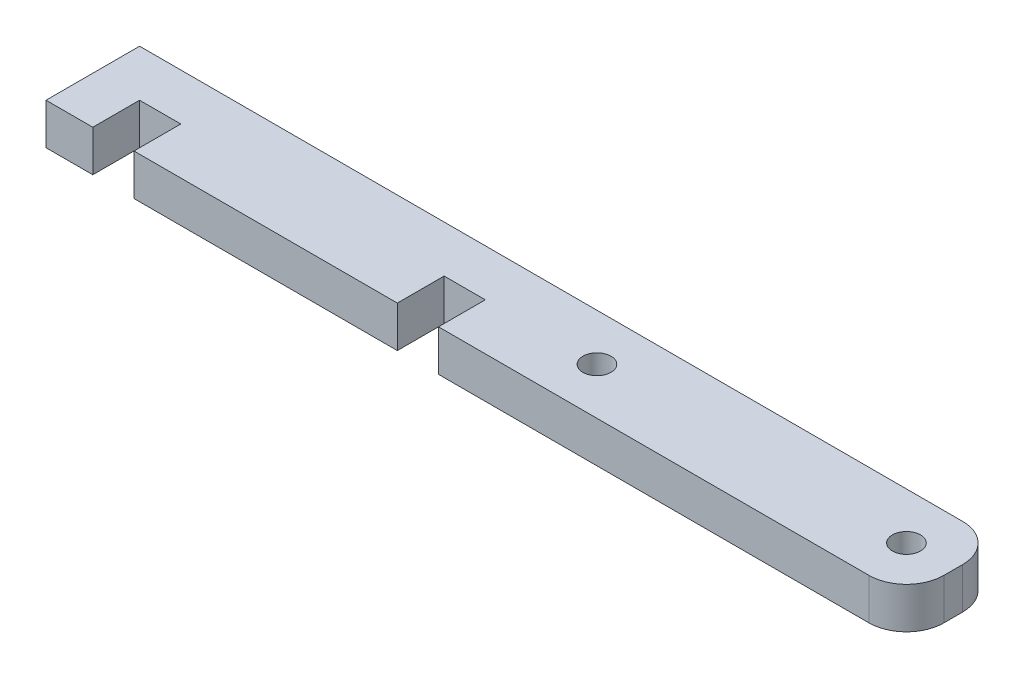
ISO-10303-21;
HEADER;
FILE_DESCRIPTION(('STEP AP214'),'2;1');
FILE_NAME('part.step','',(''),(''),'','','');
FILE_SCHEMA(('AUTOMOTIVE_DESIGN { 1 0 10303 214 1 1 1 1 }'));
ENDSEC;
DATA;
#1=APPLICATION_CONTEXT('core data for automotive mechanical design processes');
#2=APPLICATION_PROTOCOL_DEFINITION('international standard','automotive_design',2000,#1);
#3=PRODUCT_CONTEXT('',#1,'mechanical');
#4=PRODUCT('Part','Part','',(#3));
#5=PRODUCT_RELATED_PRODUCT_CATEGORY('part','',(#4));
#6=PRODUCT_DEFINITION_FORMATION('','',#4);
#7=PRODUCT_DEFINITION_CONTEXT('part definition',#1,'design');
#8=PRODUCT_DEFINITION('design','',#6,#7);
#9=PRODUCT_DEFINITION_SHAPE('','',#8);
#10=(LENGTH_UNIT() NAMED_UNIT(*) SI_UNIT(.MILLI.,.METRE.));
#11=(NAMED_UNIT(*) PLANE_ANGLE_UNIT() SI_UNIT($,.RADIAN.));
#12=(NAMED_UNIT(*) SI_UNIT($,.STERADIAN.) SOLID_ANGLE_UNIT());
#13=UNCERTAINTY_MEASURE_WITH_UNIT(LENGTH_MEASURE(1.E-05),#10,'distance_accuracy_value','');
#14=(GEOMETRIC_REPRESENTATION_CONTEXT(3) GLOBAL_UNCERTAINTY_ASSIGNED_CONTEXT((#13)) GLOBAL_UNIT_ASSIGNED_CONTEXT((#10,
#11,#12)) REPRESENTATION_CONTEXT('',''));
#15=CARTESIAN_POINT('',(0.,0.,0.));
#16=DIRECTION('',(0.,0.,1.));
#17=DIRECTION('',(1.,0.,0.));
#18=AXIS2_PLACEMENT_3D('',#15,#16,#17);
#19=CARTESIAN_POINT('',(0.,2.794,-6.35000000000001));
#20=DIRECTION('',(1.,0.,0.));
#21=DIRECTION('',(0.,0.,-1.));
#22=AXIS2_PLACEMENT_3D('',#19,#20,#21);
#23=PLANE('',#22);
#24=DIRECTION('',(0.,0.,1.));
#25=VECTOR('',#24,1.);
#26=CARTESIAN_POINT('',(0.,0.,-6.35000000000001));
#27=LINE('',#26,#25);
#28=CARTESIAN_POINT('',(0.,0.,-6.35000000000001));
#29=VERTEX_POINT('',#28);
#30=CARTESIAN_POINT('',(0.,0.,0.));
#31=VERTEX_POINT('',#30);
#32=EDGE_CURVE('E157',#29,#31,#27,.T.);
#33=ORIENTED_EDGE('',*,*,#32,.T.);
#34=DIRECTION('',(0.,-1.,0.));
#35=VECTOR('',#34,1.);
#36=CARTESIAN_POINT('',(0.,2.794,0.));
#37=LINE('',#36,#35);
#38=CARTESIAN_POINT('',(0.,2.794,0.));
#39=VERTEX_POINT('',#38);
#40=EDGE_CURVE('E140',#39,#31,#37,.T.);
#41=ORIENTED_EDGE('',*,*,#40,.F.);
#42=DIRECTION('',(0.,0.,1.));
#43=VECTOR('',#42,1.);
#44=CARTESIAN_POINT('',(0.,2.794,-6.35000000000001));
#45=LINE('',#44,#43);
#46=CARTESIAN_POINT('',(0.,2.794,-6.35000000000001));
#47=VERTEX_POINT('',#46);
#48=EDGE_CURVE('E146',#47,#39,#45,.T.);
#49=ORIENTED_EDGE('',*,*,#48,.F.);
#50=DIRECTION('',(0.,-1.,0.));
#51=VECTOR('',#50,1.);
#52=CARTESIAN_POINT('',(0.,2.794,-6.35000000000001));
#53=LINE('',#52,#51);
#54=EDGE_CURVE('E204',#47,#29,#53,.T.);
#55=ORIENTED_EDGE('',*,*,#54,.T.);
#56=EDGE_LOOP('',(#33,#41,#49,#55));
#57=FACE_BOUND('',#56,.T.);
#58=ADVANCED_FACE('F32',(#57),#23,.F.);
#59=CARTESIAN_POINT('',(0.,2.794,0.));
#60=DIRECTION('',(0.,0.,-1.));
#61=DIRECTION('',(-1.,0.,0.));
#62=AXIS2_PLACEMENT_3D('',#59,#60,#61);
#63=PLANE('',#62);
#64=DIRECTION('',(1.,0.,0.));
#65=VECTOR('',#64,1.);
#66=CARTESIAN_POINT('',(0.,0.,0.));
#67=LINE('',#66,#65);
#68=CARTESIAN_POINT('',(3.17499999999998,0.,0.));
#69=VERTEX_POINT('',#68);
#70=EDGE_CURVE('E239',#31,#69,#67,.T.);
#71=ORIENTED_EDGE('',*,*,#70,.T.);
#72=DIRECTION('',(0.,-1.,0.));
#73=VECTOR('',#72,1.);
#74=CARTESIAN_POINT('',(3.17499999999998,2.794,0.));
#75=LINE('',#74,#73);
#76=CARTESIAN_POINT('',(3.17499999999998,2.794,0.));
#77=VERTEX_POINT('',#76);
#78=EDGE_CURVE('E143',#77,#69,#75,.T.);
#79=ORIENTED_EDGE('',*,*,#78,.F.);
#80=DIRECTION('',(1.,0.,0.));
#81=VECTOR('',#80,1.);
#82=CARTESIAN_POINT('',(0.,2.794,0.));
#83=LINE('',#82,#81);
#84=EDGE_CURVE('E136',#39,#77,#83,.T.);
#85=ORIENTED_EDGE('',*,*,#84,.F.);
#86=ORIENTED_EDGE('',*,*,#40,.T.);
#87=EDGE_LOOP('',(#71,#79,#85,#86));
#88=FACE_BOUND('',#87,.T.);
#89=ADVANCED_FACE('F138',(#88),#63,.F.);
#90=CARTESIAN_POINT('',(3.17499999999998,2.794,0.));
#91=DIRECTION('',(-1.,0.,0.));
#92=DIRECTION('',(0.,0.,1.));
#93=AXIS2_PLACEMENT_3D('',#90,#91,#92);
#94=PLANE('',#93);
#95=DIRECTION('',(0.,0.,-1.));
#96=VECTOR('',#95,1.);
#97=CARTESIAN_POINT('',(3.17499999999998,0.,0.));
#98=LINE('',#97,#96);
#99=CARTESIAN_POINT('',(3.17499999999998,0.,-3.175));
#100=VERTEX_POINT('',#99);
#101=EDGE_CURVE('E233',#69,#100,#98,.T.);
#102=ORIENTED_EDGE('',*,*,#101,.T.);
#103=DIRECTION('',(0.,-1.,0.));
#104=VECTOR('',#103,1.);
#105=CARTESIAN_POINT('',(3.17499999999998,2.794,-3.175));
#106=LINE('',#105,#104);
#107=CARTESIAN_POINT('',(3.17499999999998,2.794,-3.175));
#108=VERTEX_POINT('',#107);
#109=EDGE_CURVE('E162',#108,#100,#106,.T.);
#110=ORIENTED_EDGE('',*,*,#109,.F.);
#111=DIRECTION('',(0.,0.,-1.));
#112=VECTOR('',#111,1.);
#113=CARTESIAN_POINT('',(3.17499999999998,2.794,0.));
#114=LINE('',#113,#112);
#115=EDGE_CURVE('E145',#77,#108,#114,.T.);
#116=ORIENTED_EDGE('',*,*,#115,.F.);
#117=ORIENTED_EDGE('',*,*,#78,.T.);
#118=EDGE_LOOP('',(#102,#110,#116,#117));
#119=FACE_BOUND('',#118,.T.);
#120=ADVANCED_FACE('F265',(#119),#94,.F.);
#121=CARTESIAN_POINT('',(3.17499999999998,2.794,-3.175));
#122=DIRECTION('',(0.,0.,-1.));
#123=DIRECTION('',(-1.,0.,0.));
#124=AXIS2_PLACEMENT_3D('',#121,#122,#123);
#125=PLANE('',#124);
#126=DIRECTION('',(1.,0.,0.));
#127=VECTOR('',#126,1.);
#128=CARTESIAN_POINT('',(3.17499999999998,0.,-3.175));
#129=LINE('',#128,#127);
#130=CARTESIAN_POINT('',(5.96899999999998,0.,-3.175));
#131=VERTEX_POINT('',#130);
#132=EDGE_CURVE('E228',#100,#131,#129,.T.);
#133=ORIENTED_EDGE('',*,*,#132,.T.);
#134=DIRECTION('',(0.,-1.,0.));
#135=VECTOR('',#134,1.);
#136=CARTESIAN_POINT('',(5.96899999999998,2.794,-3.175));
#137=LINE('',#136,#135);
#138=CARTESIAN_POINT('',(5.96899999999998,2.794,-3.175));
#139=VERTEX_POINT('',#138);
#140=EDGE_CURVE('E219',#139,#131,#137,.T.);
#141=ORIENTED_EDGE('',*,*,#140,.F.);
#142=DIRECTION('',(1.,0.,0.));
#143=VECTOR('',#142,1.);
#144=CARTESIAN_POINT('',(3.17499999999998,2.794,-3.175));
#145=LINE('',#144,#143);
#146=EDGE_CURVE('E229',#108,#139,#145,.T.);
#147=ORIENTED_EDGE('',*,*,#146,.F.);
#148=ORIENTED_EDGE('',*,*,#109,.T.);
#149=EDGE_LOOP('',(#133,#141,#147,#148));
#150=FACE_BOUND('',#149,.T.);
#151=ADVANCED_FACE('F226',(#150),#125,.F.);
#152=CARTESIAN_POINT('',(5.96899999999998,2.794,-3.175));
#153=DIRECTION('',(1.,0.,0.));
#154=DIRECTION('',(0.,0.,-1.));
#155=AXIS2_PLACEMENT_3D('',#152,#153,#154);
#156=PLANE('',#155);
#157=DIRECTION('',(0.,0.,1.));
#158=VECTOR('',#157,1.);
#159=CARTESIAN_POINT('',(5.96899999999998,0.,-3.175));
#160=LINE('',#159,#158);
#161=CARTESIAN_POINT('',(5.96899999999998,0.,0.));
#162=VERTEX_POINT('',#161);
#163=EDGE_CURVE('E235',#131,#162,#160,.T.);
#164=ORIENTED_EDGE('',*,*,#163,.T.);
#165=DIRECTION('',(0.,-1.,0.));
#166=VECTOR('',#165,1.);
#167=CARTESIAN_POINT('',(5.96899999999998,2.794,0.));
#168=LINE('',#167,#166);
#169=CARTESIAN_POINT('',(5.96899999999998,2.794,0.));
#170=VERTEX_POINT('',#169);
#171=EDGE_CURVE('E216',#170,#162,#168,.T.);
#172=ORIENTED_EDGE('',*,*,#171,.F.);
#173=DIRECTION('',(0.,0.,1.));
#174=VECTOR('',#173,1.);
#175=CARTESIAN_POINT('',(5.96899999999998,2.794,-3.175));
#176=LINE('',#175,#174);
#177=EDGE_CURVE('E267',#139,#170,#176,.T.);
#178=ORIENTED_EDGE('',*,*,#177,.F.);
#179=ORIENTED_EDGE('',*,*,#140,.T.);
#180=EDGE_LOOP('',(#164,#172,#178,#179));
#181=FACE_BOUND('',#180,.T.);
#182=ADVANCED_FACE('F282',(#181),#156,.F.);
#183=CARTESIAN_POINT('',(5.96899999999998,2.794,0.));
#184=DIRECTION('',(0.,0.,-1.));
#185=DIRECTION('',(-1.,0.,0.));
#186=AXIS2_PLACEMENT_3D('',#183,#184,#185);
#187=PLANE('',#186);
#188=DIRECTION('',(1.,0.,0.));
#189=VECTOR('',#188,1.);
#190=CARTESIAN_POINT('',(5.96899999999998,0.,0.));
#191=LINE('',#190,#189);
#192=CARTESIAN_POINT('',(23.8378599579661,0.,0.));
#193=VERTEX_POINT('',#192);
#194=EDGE_CURVE('E237',#162,#193,#191,.T.);
#195=ORIENTED_EDGE('',*,*,#194,.T.);
#196=DIRECTION('',(0.,-1.,0.));
#197=VECTOR('',#196,1.);
#198=CARTESIAN_POINT('',(23.8378599579661,2.794,0.));
#199=LINE('',#198,#197);
#200=CARTESIAN_POINT('',(23.8378599579661,2.794,0.));
#201=VERTEX_POINT('',#200);
#202=EDGE_CURVE('E213',#201,#193,#199,.T.);
#203=ORIENTED_EDGE('',*,*,#202,.F.);
#204=DIRECTION('',(1.,0.,0.));
#205=VECTOR('',#204,1.);
#206=CARTESIAN_POINT('',(5.96899999999998,2.794,0.));
#207=LINE('',#206,#205);
#208=EDGE_CURVE('E271',#170,#201,#207,.T.);
#209=ORIENTED_EDGE('',*,*,#208,.F.);
#210=ORIENTED_EDGE('',*,*,#171,.T.);
#211=EDGE_LOOP('',(#195,#203,#209,#210));
#212=FACE_BOUND('',#211,.T.);
#213=ADVANCED_FACE('F278',(#212),#187,.F.);
#214=CARTESIAN_POINT('',(23.8378599579661,2.794,0.));
#215=DIRECTION('',(-1.,0.,0.));
#216=DIRECTION('',(0.,0.,1.));
#217=AXIS2_PLACEMENT_3D('',#214,#215,#216);
#218=PLANE('',#217);
#219=DIRECTION('',(0.,0.,-1.));
#220=VECTOR('',#219,1.);
#221=CARTESIAN_POINT('',(23.8378599579661,0.,0.));
#222=LINE('',#221,#220);
#223=CARTESIAN_POINT('',(23.8378599579661,0.,-3.175));
#224=VERTEX_POINT('',#223);
#225=EDGE_CURVE('E244',#193,#224,#222,.T.);
#226=ORIENTED_EDGE('',*,*,#225,.T.);
#227=DIRECTION('',(0.,-1.,0.));
#228=VECTOR('',#227,1.);
#229=CARTESIAN_POINT('',(23.8378599579661,2.794,-3.175));
#230=LINE('',#229,#228);
#231=CARTESIAN_POINT('',(23.8378599579661,2.794,-3.175));
#232=VERTEX_POINT('',#231);
#233=EDGE_CURVE('E210',#232,#224,#230,.T.);
#234=ORIENTED_EDGE('',*,*,#233,.F.);
#235=DIRECTION('',(0.,0.,-1.));
#236=VECTOR('',#235,1.);
#237=CARTESIAN_POINT('',(23.8378599579661,2.794,0.));
#238=LINE('',#237,#236);
#239=EDGE_CURVE('E259',#201,#232,#238,.T.);
#240=ORIENTED_EDGE('',*,*,#239,.F.);
#241=ORIENTED_EDGE('',*,*,#202,.T.);
#242=EDGE_LOOP('',(#226,#234,#240,#241));
#243=FACE_BOUND('',#242,.T.);
#244=ADVANCED_FACE('F276',(#243),#218,.F.);
#245=CARTESIAN_POINT('',(23.8378599579661,2.794,-3.175));
#246=DIRECTION('',(0.,0.,-1.));
#247=DIRECTION('',(-1.,0.,0.));
#248=AXIS2_PLACEMENT_3D('',#245,#246,#247);
#249=PLANE('',#248);
#250=DIRECTION('',(1.,0.,0.));
#251=VECTOR('',#250,1.);
#252=CARTESIAN_POINT('',(23.8378599579661,0.,-3.175));
#253=LINE('',#252,#251);
#254=CARTESIAN_POINT('',(26.6318599579661,0.,-3.175));
#255=VERTEX_POINT('',#254);
#256=EDGE_CURVE('E199',#224,#255,#253,.T.);
#257=ORIENTED_EDGE('',*,*,#256,.T.);
#258=DIRECTION('',(0.,-1.,0.));
#259=VECTOR('',#258,1.);
#260=CARTESIAN_POINT('',(26.6318599579661,2.794,-3.175));
#261=LINE('',#260,#259);
#262=CARTESIAN_POINT('',(26.6318599579661,2.794,-3.175));
#263=VERTEX_POINT('',#262);
#264=EDGE_CURVE('E207',#263,#255,#261,.T.);
#265=ORIENTED_EDGE('',*,*,#264,.F.);
#266=DIRECTION('',(1.,0.,0.));
#267=VECTOR('',#266,1.);
#268=CARTESIAN_POINT('',(23.8378599579661,2.794,-3.175));
#269=LINE('',#268,#267);
#270=EDGE_CURVE('E256',#232,#263,#269,.T.);
#271=ORIENTED_EDGE('',*,*,#270,.F.);
#272=ORIENTED_EDGE('',*,*,#233,.T.);
#273=EDGE_LOOP('',(#257,#265,#271,#272));
#274=FACE_BOUND('',#273,.T.);
#275=ADVANCED_FACE('F248',(#274),#249,.F.);
#276=CARTESIAN_POINT('',(26.6318599579661,2.794,-3.175));
#277=DIRECTION('',(1.,0.,0.));
#278=DIRECTION('',(0.,0.,-1.));
#279=AXIS2_PLACEMENT_3D('',#276,#277,#278);
#280=PLANE('',#279);
#281=DIRECTION('',(0.,0.,1.));
#282=VECTOR('',#281,1.);
#283=CARTESIAN_POINT('',(26.6318599579661,0.,-3.175));
#284=LINE('',#283,#282);
#285=CARTESIAN_POINT('',(26.6318599579661,0.,0.));
#286=VERTEX_POINT('',#285);
#287=EDGE_CURVE('E196',#255,#286,#284,.T.);
#288=ORIENTED_EDGE('',*,*,#287,.T.);
#289=DIRECTION('',(0.,-1.,0.));
#290=VECTOR('',#289,1.);
#291=CARTESIAN_POINT('',(26.6318599579661,2.794,0.));
#292=LINE('',#291,#290);
#293=CARTESIAN_POINT('',(26.6318599579661,2.794,0.));
#294=VERTEX_POINT('',#293);
#295=EDGE_CURVE('E195',#294,#286,#292,.T.);
#296=ORIENTED_EDGE('',*,*,#295,.F.);
#297=DIRECTION('',(0.,0.,1.));
#298=VECTOR('',#297,1.);
#299=CARTESIAN_POINT('',(26.6318599579661,2.794,-3.175));
#300=LINE('',#299,#298);
#301=EDGE_CURVE('E255',#263,#294,#300,.T.);
#302=ORIENTED_EDGE('',*,*,#301,.F.);
#303=ORIENTED_EDGE('',*,*,#264,.T.);
#304=EDGE_LOOP('',(#288,#296,#302,#303));
#305=FACE_BOUND('',#304,.T.);
#306=ADVANCED_FACE('F254',(#305),#280,.F.);
#307=CARTESIAN_POINT('',(26.6318599579661,2.794,0.));
#308=DIRECTION('',(0.,0.,-1.));
#309=DIRECTION('',(-1.,0.,0.));
#310=AXIS2_PLACEMENT_3D('',#307,#308,#309);
#311=PLANE('',#310);
#312=DIRECTION('',(1.,0.,0.));
#313=VECTOR('',#312,1.);
#314=CARTESIAN_POINT('',(26.6318599579661,0.,0.));
#315=LINE('',#314,#313);
#316=CARTESIAN_POINT('',(55.8418599579661,0.,0.));
#317=VERTEX_POINT('',#316);
#318=EDGE_CURVE('E190',#286,#317,#315,.T.);
#319=ORIENTED_EDGE('',*,*,#318,.T.);
#320=DIRECTION('',(0.,-1.,0.));
#321=VECTOR('',#320,1.);
#322=CARTESIAN_POINT('',(55.8418599579661,2.794,0.));
#323=LINE('',#322,#321);
#324=CARTESIAN_POINT('',(55.8418599579661,2.794,0.));
#325=VERTEX_POINT('',#324);
#326=EDGE_CURVE('E55',#317,#325,#323,.F.);
#327=ORIENTED_EDGE('',*,*,#326,.T.);
#328=DIRECTION('',(1.,0.,0.));
#329=VECTOR('',#328,1.);
#330=CARTESIAN_POINT('',(26.6318599579661,2.794,0.));
#331=LINE('',#330,#329);
#332=EDGE_CURVE('E176',#294,#325,#331,.T.);
#333=ORIENTED_EDGE('',*,*,#332,.F.);
#334=ORIENTED_EDGE('',*,*,#295,.T.);
#335=EDGE_LOOP('',(#319,#327,#333,#334));
#336=FACE_BOUND('',#335,.T.);
#337=ADVANCED_FACE('F193',(#336),#311,.F.);
#338=CARTESIAN_POINT('',(58.3818599579661,2.794,0.));
#339=DIRECTION('',(-1.,0.,0.));
#340=DIRECTION('',(0.,0.,1.));
#341=AXIS2_PLACEMENT_3D('',#338,#339,#340);
#342=PLANE('',#341);
#343=DIRECTION('',(0.,0.,-1.));
#344=VECTOR('',#343,1.);
#345=CARTESIAN_POINT('',(58.3818599579661,2.794,0.));
#346=LINE('',#345,#344);
#347=CARTESIAN_POINT('',(58.3818599579661,2.794,-2.54000000000001));
#348=VERTEX_POINT('',#347);
#349=CARTESIAN_POINT('',(58.3818599579661,2.794,-3.81000000000001));
#350=VERTEX_POINT('',#349);
#351=EDGE_CURVE('E175',#348,#350,#346,.T.);
#352=ORIENTED_EDGE('',*,*,#351,.F.);
#353=DIRECTION('',(0.,-1.,0.));
#354=VECTOR('',#353,1.);
#355=CARTESIAN_POINT('',(58.3818599579661,2.794,-2.54000000000001));
#356=LINE('',#355,#354);
#357=CARTESIAN_POINT('',(58.3818599579661,0.,-2.54000000000001));
#358=VERTEX_POINT('',#357);
#359=EDGE_CURVE('E160',#348,#358,#356,.T.);
#360=ORIENTED_EDGE('',*,*,#359,.T.);
#361=DIRECTION('',(0.,0.,-1.));
#362=VECTOR('',#361,1.);
#363=CARTESIAN_POINT('',(58.3818599579661,0.,0.));
#364=LINE('',#363,#362);
#365=CARTESIAN_POINT('',(58.3818599579661,0.,-3.81000000000001));
#366=VERTEX_POINT('',#365);
#367=EDGE_CURVE('E191',#358,#366,#364,.T.);
#368=ORIENTED_EDGE('',*,*,#367,.T.);
#369=DIRECTION('',(0.,-1.,0.));
#370=VECTOR('',#369,1.);
#371=CARTESIAN_POINT('',(58.3818599579661,2.794,-3.81000000000001));
#372=LINE('',#371,#370);
#373=EDGE_CURVE('E158',#366,#350,#372,.F.);
#374=ORIENTED_EDGE('',*,*,#373,.T.);
#375=EDGE_LOOP('',(#352,#360,#368,#374));
#376=FACE_BOUND('',#375,.T.);
#377=ADVANCED_FACE('F180',(#376),#342,.F.);
#378=CARTESIAN_POINT('',(58.3818599579661,2.794,-6.35000000000001));
#379=DIRECTION('',(0.,0.,1.));
#380=DIRECTION('',(1.,0.,0.));
#381=AXIS2_PLACEMENT_3D('',#378,#379,#380);
#382=PLANE('',#381);
#383=DIRECTION('',(-1.,0.,0.));
#384=VECTOR('',#383,1.);
#385=CARTESIAN_POINT('',(58.3818599579661,2.794,-6.35000000000001));
#386=LINE('',#385,#384);
#387=CARTESIAN_POINT('',(55.8418599579661,2.794,-6.35000000000001));
#388=VERTEX_POINT('',#387);
#389=EDGE_CURVE('E150',#388,#47,#386,.T.);
#390=ORIENTED_EDGE('',*,*,#389,.F.);
#391=DIRECTION('',(0.,-1.,0.));
#392=VECTOR('',#391,1.);
#393=CARTESIAN_POINT('',(55.8418599579661,2.794,-6.35000000000001));
#394=LINE('',#393,#392);
#395=CARTESIAN_POINT('',(55.8418599579661,0.,-6.35000000000001));
#396=VERTEX_POINT('',#395);
#397=EDGE_CURVE('E11',#388,#396,#394,.T.);
#398=ORIENTED_EDGE('',*,*,#397,.T.);
#399=DIRECTION('',(-1.,0.,0.));
#400=VECTOR('',#399,1.);
#401=CARTESIAN_POINT('',(58.3818599579661,0.,-6.35000000000001));
#402=LINE('',#401,#400);
#403=EDGE_CURVE('E154',#396,#29,#402,.T.);
#404=ORIENTED_EDGE('',*,*,#403,.T.);
#405=ORIENTED_EDGE('',*,*,#54,.F.);
#406=EDGE_LOOP('',(#390,#398,#404,#405));
#407=FACE_BOUND('',#406,.T.);
#408=ADVANCED_FACE('F318',(#407),#382,.F.);
#409=CARTESIAN_POINT('',(0.,2.794,0.));
#410=DIRECTION('',(0.,1.,0.));
#411=DIRECTION('',(0.,0.,1.));
#412=AXIS2_PLACEMENT_3D('',#409,#410,#411);
#413=PLANE('',#412);
#414=CARTESIAN_POINT('',(34.2068599579661,2.794,-3.17500000000001));
#415=DIRECTION('',(0.,1.,0.));
#416=DIRECTION('',(0.,0.,1.));
#417=AXIS2_PLACEMENT_3D('',#414,#415,#416);
#418=CIRCLE('',#417,0.952500000000004);
#419=CARTESIAN_POINT('',(34.2068599579661,2.794,-2.22250000000001));
#420=VERTEX_POINT('',#419);
#421=EDGE_CURVE('E448',#420,#420,#418,.T.);
#422=ORIENTED_EDGE('',*,*,#421,.F.);
#423=EDGE_LOOP('',(#422));
#424=FACE_BOUND('',#423,.T.);
#425=CARTESIAN_POINT('',(55.2068599579661,2.794,-3.17500000000001));
#426=DIRECTION('',(0.,1.,0.));
#427=DIRECTION('',(0.,0.,1.));
#428=AXIS2_PLACEMENT_3D('',#425,#426,#427);
#429=CIRCLE('',#428,0.952500000000004);
#430=CARTESIAN_POINT('',(55.2068599579661,2.794,-2.22250000000001));
#431=VERTEX_POINT('',#430);
#432=EDGE_CURVE('E443',#431,#431,#429,.T.);
#433=ORIENTED_EDGE('',*,*,#432,.F.);
#434=EDGE_LOOP('',(#433));
#435=FACE_BOUND('',#434,.T.);
#436=ORIENTED_EDGE('',*,*,#332,.T.);
#437=CARTESIAN_POINT('',(55.8418599579661,2.794,-2.54000000000001));
#438=DIRECTION('',(0.,1.,0.));
#439=DIRECTION('',(0.,0.,1.));
#440=AXIS2_PLACEMENT_3D('',#437,#438,#439);
#441=CIRCLE('',#440,2.54);
#442=EDGE_CURVE('E40',#325,#348,#441,.T.);
#443=ORIENTED_EDGE('',*,*,#442,.T.);
#444=ORIENTED_EDGE('',*,*,#351,.T.);
#445=CARTESIAN_POINT('',(55.8418599579661,2.794,-3.81000000000001));
#446=DIRECTION('',(0.,1.,0.));
#447=DIRECTION('',(0.,0.,1.));
#448=AXIS2_PLACEMENT_3D('',#445,#446,#447);
#449=CIRCLE('',#448,2.54);
#450=EDGE_CURVE('E47',#350,#388,#449,.T.);
#451=ORIENTED_EDGE('',*,*,#450,.T.);
#452=ORIENTED_EDGE('',*,*,#389,.T.);
#453=ORIENTED_EDGE('',*,*,#48,.T.);
#454=ORIENTED_EDGE('',*,*,#84,.T.);
#455=ORIENTED_EDGE('',*,*,#115,.T.);
#456=ORIENTED_EDGE('',*,*,#146,.T.);
#457=ORIENTED_EDGE('',*,*,#177,.T.);
#458=ORIENTED_EDGE('',*,*,#208,.T.);
#459=ORIENTED_EDGE('',*,*,#239,.T.);
#460=ORIENTED_EDGE('',*,*,#270,.T.);
#461=ORIENTED_EDGE('',*,*,#301,.T.);
#462=EDGE_LOOP('',(#436,#443,#444,#451,#452,#453,#454,#455,#456,#457,#458,#459,#460,#461));
#463=FACE_BOUND('',#462,.T.);
#464=ADVANCED_FACE('F149',(#424,#435,#463),#413,.T.);
#465=CARTESIAN_POINT('',(0.,0.,0.));
#466=DIRECTION('',(0.,1.,0.));
#467=DIRECTION('',(0.,0.,1.));
#468=AXIS2_PLACEMENT_3D('',#465,#466,#467);
#469=PLANE('',#468);
#470=CARTESIAN_POINT('',(34.2068599579661,0.,-3.17500000000001));
#471=DIRECTION('',(0.,1.,0.));
#472=DIRECTION('',(0.,0.,1.));
#473=AXIS2_PLACEMENT_3D('',#470,#471,#472);
#474=CIRCLE('',#473,0.952500000000004);
#475=CARTESIAN_POINT('',(34.2068599579661,0.,-2.22250000000001));
#476=VERTEX_POINT('',#475);
#477=EDGE_CURVE('E440',#476,#476,#474,.T.);
#478=ORIENTED_EDGE('',*,*,#477,.T.);
#479=EDGE_LOOP('',(#478));
#480=FACE_BOUND('',#479,.T.);
#481=CARTESIAN_POINT('',(55.2068599579661,0.,-3.17500000000001));
#482=DIRECTION('',(0.,1.,0.));
#483=DIRECTION('',(0.,0.,1.));
#484=AXIS2_PLACEMENT_3D('',#481,#482,#483);
#485=CIRCLE('',#484,0.952500000000004);
#486=CARTESIAN_POINT('',(55.2068599579661,0.,-2.22250000000001));
#487=VERTEX_POINT('',#486);
#488=EDGE_CURVE('E264',#487,#487,#485,.T.);
#489=ORIENTED_EDGE('',*,*,#488,.T.);
#490=EDGE_LOOP('',(#489));
#491=FACE_BOUND('',#490,.T.);
#492=ORIENTED_EDGE('',*,*,#367,.F.);
#493=CARTESIAN_POINT('',(55.8418599579661,0.,-2.54000000000001));
#494=DIRECTION('',(0.,1.,0.));
#495=DIRECTION('',(0.,0.,1.));
#496=AXIS2_PLACEMENT_3D('',#493,#494,#495);
#497=CIRCLE('',#496,2.54);
#498=EDGE_CURVE('E170',#358,#317,#497,.F.);
#499=ORIENTED_EDGE('',*,*,#498,.T.);
#500=ORIENTED_EDGE('',*,*,#318,.F.);
#501=ORIENTED_EDGE('',*,*,#287,.F.);
#502=ORIENTED_EDGE('',*,*,#256,.F.);
#503=ORIENTED_EDGE('',*,*,#225,.F.);
#504=ORIENTED_EDGE('',*,*,#194,.F.);
#505=ORIENTED_EDGE('',*,*,#163,.F.);
#506=ORIENTED_EDGE('',*,*,#132,.F.);
#507=ORIENTED_EDGE('',*,*,#101,.F.);
#508=ORIENTED_EDGE('',*,*,#70,.F.);
#509=ORIENTED_EDGE('',*,*,#32,.F.);
#510=ORIENTED_EDGE('',*,*,#403,.F.);
#511=CARTESIAN_POINT('',(55.8418599579661,0.,-3.81000000000001));
#512=DIRECTION('',(0.,1.,0.));
#513=DIRECTION('',(0.,0.,1.));
#514=AXIS2_PLACEMENT_3D('',#511,#512,#513);
#515=CIRCLE('',#514,2.54);
#516=EDGE_CURVE('E168',#396,#366,#515,.F.);
#517=ORIENTED_EDGE('',*,*,#516,.T.);
#518=EDGE_LOOP('',(#492,#499,#500,#501,#502,#503,#504,#505,#506,#507,#508,#509,#510,#517));
#519=FACE_BOUND('',#518,.T.);
#520=ADVANCED_FACE('F188',(#480,#491,#519),#469,.F.);
#521=CARTESIAN_POINT('',(55.2068599579661,0.,-3.17500000000001));
#522=DIRECTION('',(0.,1.,0.));
#523=DIRECTION('',(0.,0.,1.));
#524=AXIS2_PLACEMENT_3D('',#521,#522,#523);
#525=CYLINDRICAL_SURFACE('',#524,0.952500000000004);
#526=ORIENTED_EDGE('',*,*,#488,.F.);
#527=EDGE_LOOP('',(#526));
#528=FACE_BOUND('',#527,.T.);
#529=ORIENTED_EDGE('',*,*,#432,.T.);
#530=EDGE_LOOP('',(#529));
#531=FACE_BOUND('',#530,.T.);
#532=ADVANCED_FACE('F305',(#528,#531),#525,.F.);
#533=CARTESIAN_POINT('',(34.2068599579661,0.,-3.17500000000001));
#534=DIRECTION('',(0.,1.,0.));
#535=DIRECTION('',(0.,0.,1.));
#536=AXIS2_PLACEMENT_3D('',#533,#534,#535);
#537=CYLINDRICAL_SURFACE('',#536,0.952500000000004);
#538=ORIENTED_EDGE('',*,*,#477,.F.);
#539=EDGE_LOOP('',(#538));
#540=FACE_BOUND('',#539,.T.);
#541=ORIENTED_EDGE('',*,*,#421,.T.);
#542=EDGE_LOOP('',(#541));
#543=FACE_BOUND('',#542,.T.);
#544=ADVANCED_FACE('F299',(#540,#543),#537,.F.);
#545=CARTESIAN_POINT('',(55.8418599579661,2.794,-2.54000000000001));
#546=DIRECTION('',(0.,-1.,0.));
#547=DIRECTION('',(0.,0.,-1.));
#548=AXIS2_PLACEMENT_3D('',#545,#546,#547);
#549=CYLINDRICAL_SURFACE('',#548,2.54);
#550=ORIENTED_EDGE('',*,*,#442,.F.);
#551=ORIENTED_EDGE('',*,*,#326,.F.);
#552=ORIENTED_EDGE('',*,*,#498,.F.);
#553=ORIENTED_EDGE('',*,*,#359,.F.);
#554=EDGE_LOOP('',(#550,#551,#552,#553));
#555=FACE_BOUND('',#554,.T.);
#556=ADVANCED_FACE('F185',(#555),#549,.T.);
#557=CARTESIAN_POINT('',(55.8418599579661,2.794,-3.81000000000001));
#558=DIRECTION('',(0.,-1.,0.));
#559=DIRECTION('',(0.,0.,-1.));
#560=AXIS2_PLACEMENT_3D('',#557,#558,#559);
#561=CYLINDRICAL_SURFACE('',#560,2.54);
#562=ORIENTED_EDGE('',*,*,#450,.F.);
#563=ORIENTED_EDGE('',*,*,#373,.F.);
#564=ORIENTED_EDGE('',*,*,#516,.F.);
#565=ORIENTED_EDGE('',*,*,#397,.F.);
#566=EDGE_LOOP('',(#562,#563,#564,#565));
#567=FACE_BOUND('',#566,.T.);
#568=ADVANCED_FACE('F34',(#567),#561,.T.);
#569=CLOSED_SHELL('',(#58,#89,#120,#151,#182,#213,#244,#275,#306,#337,#377,#408,#464,#520,#532,
#544,#556,#568));
#570=MANIFOLD_SOLID_BREP('B2',#569);
#571=ADVANCED_BREP_SHAPE_REPRESENTATION('',(#18,#570),#14);
#572=SHAPE_DEFINITION_REPRESENTATION(#9,#571);
ENDSEC;
END-ISO-10303-21;
